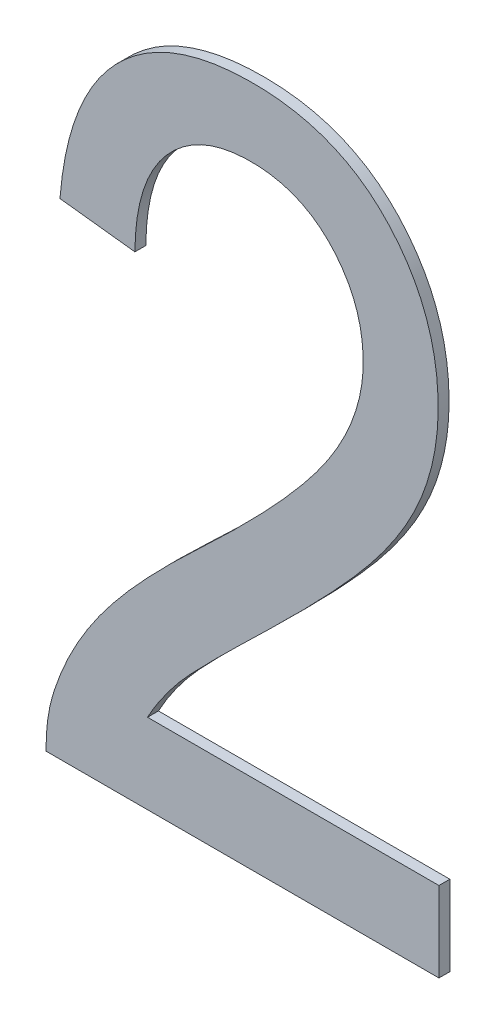
ISO-10303-21;
HEADER;
FILE_DESCRIPTION(('STEP AP214'),'2;1');
FILE_NAME('part.step','',(''),(''),'','','');
FILE_SCHEMA(('AUTOMOTIVE_DESIGN { 1 0 10303 214 1 1 1 1 }'));
ENDSEC;
DATA;
#1=APPLICATION_CONTEXT('core data for automotive mechanical design processes');
#2=APPLICATION_PROTOCOL_DEFINITION('international standard','automotive_design',2000,#1);
#3=PRODUCT_CONTEXT('',#1,'mechanical');
#4=PRODUCT('Part','Part','',(#3));
#5=PRODUCT_RELATED_PRODUCT_CATEGORY('part','',(#4));
#6=PRODUCT_DEFINITION_FORMATION('','',#4);
#7=PRODUCT_DEFINITION_CONTEXT('part definition',#1,'design');
#8=PRODUCT_DEFINITION('design','',#6,#7);
#9=PRODUCT_DEFINITION_SHAPE('','',#8);
#10=(LENGTH_UNIT() NAMED_UNIT(*) SI_UNIT(.MILLI.,.METRE.));
#11=(NAMED_UNIT(*) PLANE_ANGLE_UNIT() SI_UNIT($,.RADIAN.));
#12=(NAMED_UNIT(*) SI_UNIT($,.STERADIAN.) SOLID_ANGLE_UNIT());
#13=UNCERTAINTY_MEASURE_WITH_UNIT(LENGTH_MEASURE(1.E-05),#10,'distance_accuracy_value','');
#14=(GEOMETRIC_REPRESENTATION_CONTEXT(3) GLOBAL_UNCERTAINTY_ASSIGNED_CONTEXT((#13)) GLOBAL_UNIT_ASSIGNED_CONTEXT((#10,
#11,#12)) REPRESENTATION_CONTEXT('',''));
#15=CARTESIAN_POINT('',(0.,0.,0.));
#16=DIRECTION('',(0.,0.,1.));
#17=DIRECTION('',(1.,0.,0.));
#18=AXIS2_PLACEMENT_3D('',#15,#16,#17);
#19=CARTESIAN_POINT('',(2.715021731701,1.638412000728,1.11));
#20=DIRECTION('',(0.,0.,1.));
#21=DIRECTION('',(1.,0.,0.));
#22=AXIS2_PLACEMENT_3D('',#19,#20,#21);
#23=PLANE('',#22);
#24=CARTESIAN_POINT('',(2.721213661321,1.66435850046,1.11));
#25=CARTESIAN_POINT('',(2.72329393000518,1.67070243349372,1.11));
#26=CARTESIAN_POINT('',(2.72563352330744,1.67695689699947,1.11));
#27=CARTESIAN_POINT('',(2.72949501810525,1.68618847283412,1.11));
#28=CARTESIAN_POINT('',(2.73084039391473,1.6892397189239,1.11));
#29=CARTESIAN_POINT('',(2.73364261307884,1.69529050040378,1.11));
#30=CARTESIAN_POINT('',(2.73509945493101,1.69829003649021,1.11));
#31=CARTESIAN_POINT('',(2.73811815597819,1.7042357031484,1.11));
#32=CARTESIAN_POINT('',(2.73968001375582,1.70718183444026,1.11));
#33=CARTESIAN_POINT('',(2.74290222774084,1.71301945313452,1.11));
#34=CARTESIAN_POINT('',(2.74456258264867,1.7159109412572,1.11));
#35=CARTESIAN_POINT('',(2.74968378782231,1.72450543570374,1.11));
#36=CARTESIAN_POINT('',(2.75328371696529,1.730126397295,1.11));
#37=CARTESIAN_POINT('',(2.75892231477634,1.73839067284267,1.11));
#38=CARTESIAN_POINT('',(2.76084123938253,1.74111706190323,1.11));
#39=CARTESIAN_POINT('',(2.76475453638159,1.74651521539679,1.11));
#40=CARTESIAN_POINT('',(2.76674890804817,1.74918698035525,1.11));
#41=CARTESIAN_POINT('',(2.77283387890472,1.75712580540549,1.11));
#42=CARTESIAN_POINT('',(2.77702567110063,1.76231543313442,1.11));
#43=CARTESIAN_POINT('',(2.7834574555508,1.76997582400764,1.11));
#44=CARTESIAN_POINT('',(2.78562514703337,1.77250833377801,1.11));
#45=CARTESIAN_POINT('',(2.79219250144971,1.78005091260165,1.11));
#46=CARTESIAN_POINT('',(2.7966561042431,1.78500561279414,1.11));
#47=CARTESIAN_POINT('',(2.80344910716326,1.79234581829642,1.11));
#48=CARTESIAN_POINT('',(2.80572958902368,1.79477712423331,1.11));
#49=CARTESIAN_POINT('',(2.81261558787977,1.8020292475984,1.11));
#50=CARTESIAN_POINT('',(2.81726546260141,1.80680805429039,1.11));
#51=CARTESIAN_POINT('',(2.82665704888424,1.8162740774786,1.11));
#52=CARTESIAN_POINT('',(2.8313987585874,1.82096129582401,1.11));
#53=CARTESIAN_POINT('',(2.84096857758662,1.83024625279108,1.11));
#54=CARTESIAN_POINT('',(2.8457966857712,1.83484399256224,1.11));
#55=CARTESIAN_POINT('',(2.85548429315481,1.84400128193863,1.11));
#56=CARTESIAN_POINT('',(2.86034377547747,1.84856084946522,1.11));
#57=CARTESIAN_POINT('',(2.86999465272104,1.85775128290534,1.11));
#58=CARTESIAN_POINT('',(2.87478604856247,1.86238214785316,1.11));
#59=CARTESIAN_POINT('',(2.88909290259023,1.87637450451791,1.11));
#60=CARTESIAN_POINT('',(2.89852613910238,1.8858218722776,1.11));
#61=CARTESIAN_POINT('',(2.92056775807019,1.90865737564033,1.11));
#62=CARTESIAN_POINT('',(2.93302818909029,1.92218500261644,1.11));
#63=CARTESIAN_POINT('',(2.95668506890696,1.95033739204939,1.11));
#64=CARTESIAN_POINT('',(2.9678859382484,1.96495799723825,1.11));
#65=CARTESIAN_POINT('',(2.98180189965767,1.98811871521336,1.11));
#66=CARTESIAN_POINT('',(2.98588152230096,1.99581206259684,1.11));
#67=CARTESIAN_POINT('',(2.9930160694067,2.01166480286425,1.11));
#68=CARTESIAN_POINT('',(2.99607155694556,2.01982393675802,1.11));
#69=CARTESIAN_POINT('',(3.00081141445837,2.03668508620058,1.11));
#70=CARTESIAN_POINT('',(3.00247481854467,2.0453933500611,1.11));
#71=CARTESIAN_POINT('',(3.00397645251367,2.06296722689954,1.11));
#72=CARTESIAN_POINT('',(3.00381667676767,2.07183265735181,1.11));
#73=CARTESIAN_POINT('',(3.00202839787972,2.08669495100788,1.11));
#74=CARTESIAN_POINT('',(3.00085772709035,2.09275002786826,1.11));
#75=CARTESIAN_POINT('',(2.9975022575742,2.10457603326352,1.11));
#76=CARTESIAN_POINT('',(2.99531888857233,2.11034734974715,1.11));
#77=CARTESIAN_POINT('',(2.98994871458463,2.12141227550954,1.11));
#78=CARTESIAN_POINT('',(2.98675984514569,2.12670487287135,1.11));
#79=CARTESIAN_POINT('',(2.97955281446159,2.13670366257281,1.11));
#80=CARTESIAN_POINT('',(2.97553328096734,2.14140886364084,1.11));
#81=CARTESIAN_POINT('',(2.96676926818237,2.14994131200798,1.11));
#82=CARTESIAN_POINT('',(2.962038232671,2.15378208974685,1.11));
#83=CARTESIAN_POINT('',(2.95191267518114,2.16041298462471,1.11));
#84=CARTESIAN_POINT('',(2.94652066642477,2.16320692719363,1.11));
#85=CARTESIAN_POINT('',(2.9313372659297,2.16922762312125,1.11));
#86=CARTESIAN_POINT('',(2.9211140278046,2.17138209542904,1.11));
#87=CARTESIAN_POINT('',(2.90514013028058,2.17264151327572,1.11));
#88=CARTESIAN_POINT('',(2.89941517955221,2.17267477526941,1.11));
#89=CARTESIAN_POINT('',(2.88800283286891,2.17200906850209,1.11));
#90=CARTESIAN_POINT('',(2.8823153962913,2.17131110008581,1.11));
#91=CARTESIAN_POINT('',(2.87149550776904,2.16907399493723,1.11));
#92=CARTESIAN_POINT('',(2.86635127599333,2.16759376795483,1.11));
#93=CARTESIAN_POINT('',(2.85638905567219,2.16378507770012,1.11));
#94=CARTESIAN_POINT('',(2.85157068441457,2.16145763072014,1.11));
#95=CARTESIAN_POINT('',(2.84241783103275,2.15598712416586,1.11));
#96=CARTESIAN_POINT('',(2.83808375759633,2.15284338306436,1.11));
#97=CARTESIAN_POINT('',(2.82998355551045,2.14589007683995,1.11));
#98=CARTESIAN_POINT('',(2.82621820417595,2.14207961553299,1.11));
#99=CARTESIAN_POINT('',(2.81925597819165,2.13383461530065,1.11));
#100=CARTESIAN_POINT('',(2.81607237063749,2.12938886412027,1.11));
#101=CARTESIAN_POINT('',(2.81044474637974,2.12005969046976,1.11));
#102=CARTESIAN_POINT('',(2.80800029366214,2.11517652823292,1.11));
#103=CARTESIAN_POINT('',(2.80283842398331,2.10280575262099,1.11));
#104=CARTESIAN_POINT('',(2.8005146344383,2.09515522959819,1.11));
#105=CARTESIAN_POINT('',(2.7970831338037,2.07958388357653,1.11));
#106=CARTESIAN_POINT('',(2.79597949217082,2.07166224635725,1.11));
#107=CARTESIAN_POINT('',(2.7949324667285,2.05842700830469,1.11));
#108=CARTESIAN_POINT('',(2.79472349043189,2.05313366070658,1.11));
#109=CARTESIAN_POINT('',(2.794681949844,2.047849754735,1.11));
#110=B_SPLINE_CURVE_WITH_KNOTS('',3,(#24,#25,#26,#27,#28,#29,#30,#31,#32,#33,#34,#35,#36,#37,
#38,#39,#40,#41,#42,#43,#44,#45,#46,#47,#48,#49,#50,#51,#52,#53,#54,#55,#56,#57,#58,#59,#60,#61,
#62,#63,#64,#65,#66,#67,#68,#69,#70,#71,#72,#73,#74,#75,#76,#77,#78,#79,#80,#81,#82,#83,#84,#85,
#86,#87,#88,#89,#90,#91,#92,#93,#94,#95,#96,#97,#98,#99,#100,#101,#102,#103,#104,#105,#106,#107,
#108,#109),.UNSPECIFIED.,.F.,.F.,(4,2,2,2,2,2,2,2,2,2,2,2,2,2,2,2,2,2,2,2,2,2,2,2,2,2,2,2,2,2,2,
2,2,2,2,2,2,2,2,2,2,2,4),(0.,0.0200160135525452,0.0300177989460808,0.0400194495489698,
0.0500209651894125,0.0600223488995326,0.0800320950154514,0.0900331217246663,0.100034052183449,
0.120039414620357,0.130039839510025,0.150042306028592,0.160042518386877,0.180043817619683,
0.200044712602522,0.220045350469358,0.240036002474969,0.260026383949558,0.300068217682964,
0.355248880399983,0.410229402857382,0.436290561589298,0.462337368125967,0.488769739997318,
0.515173200345515,0.53360780060873,0.552016453797352,0.570463151735987,0.588940570602834,
0.607104773059731,0.625201935595861,0.655999406771053,0.673148490125452,0.690274143625454,
0.706263041437928,0.722232822452997,0.738215979815321,0.754220788629263,0.77055438079848,
0.786878319197798,0.810727316267535,0.834655617157256,0.850524383972508),.UNSPECIFIED.);
#111=CARTESIAN_POINT('',(2.721213661321,1.66435850046,1.11));
#112=VERTEX_POINT('',#111);
#113=CARTESIAN_POINT('',(2.794681949844,2.047849754735,1.11));
#114=VERTEX_POINT('',#113);
#115=EDGE_CURVE('E182',#112,#114,#110,.T.);
#116=ORIENTED_EDGE('',*,*,#115,.F.);
#117=CARTESIAN_POINT('',(2.713421570114,1.611391852731,1.11));
#118=CARTESIAN_POINT('',(2.71326292657197,1.61806923818245,1.11));
#119=CARTESIAN_POINT('',(2.71350360136354,1.62476340359135,1.11));
#120=CARTESIAN_POINT('',(2.71472074181933,1.63697885119607,1.11));
#121=CARTESIAN_POINT('',(2.71557065890197,1.6425131826524,1.11));
#122=CARTESIAN_POINT('',(2.71790279720354,1.65352036773723,1.11));
#123=CARTESIAN_POINT('',(2.7193929834949,1.65899152409922,1.11));
#124=CARTESIAN_POINT('',(2.721213661321,1.66435850046,1.11));
#125=B_SPLINE_CURVE_WITH_KNOTS('',3,(#117,#118,#119,#120,#121,#122,#123,#124),.UNSPECIFIED.,.F.,
.F.,(4,2,2,4),(0.,0.0200360460784031,0.0368007991509652,0.0537804384443434),.UNSPECIFIED.);
#126=CARTESIAN_POINT('',(2.713421570114,1.611391852731,1.11));
#127=VERTEX_POINT('',#126);
#128=EDGE_CURVE('E153',#127,#112,#125,.T.);
#129=ORIENTED_EDGE('',*,*,#128,.F.);
#130=DIRECTION('',(1.,0.,0.));
#131=VECTOR('',#130,1.);
#132=CARTESIAN_POINT('',(3.072970921521,1.611391852731,1.11));
#133=LINE('',#132,#131);
#134=CARTESIAN_POINT('',(3.072970921521,1.611391852731,1.11));
#135=VERTEX_POINT('',#134);
#136=EDGE_CURVE('E121',#135,#127,#133,.F.);
#137=ORIENTED_EDGE('',*,*,#136,.F.);
#138=DIRECTION('',(0.,1.,0.));
#139=VECTOR('',#138,1.);
#140=CARTESIAN_POINT('',(3.072970921521,1.68471805274,1.11));
#141=LINE('',#140,#139);
#142=CARTESIAN_POINT('',(3.072970921521,1.68471805274,1.11));
#143=VERTEX_POINT('',#142);
#144=EDGE_CURVE('E97',#143,#135,#141,.F.);
#145=ORIENTED_EDGE('',*,*,#144,.F.);
#146=DIRECTION('',(1.,0.,0.));
#147=VECTOR('',#146,1.);
#148=CARTESIAN_POINT('',(2.806230942168,1.68471805274,1.11));
#149=LINE('',#148,#147);
#150=CARTESIAN_POINT('',(2.806230942168,1.68471805274,1.11));
#151=VERTEX_POINT('',#150);
#152=EDGE_CURVE('E93',#151,#143,#149,.T.);
#153=ORIENTED_EDGE('',*,*,#152,.F.);
#154=CARTESIAN_POINT('',(2.726083718325,2.055802704845,1.11));
#155=CARTESIAN_POINT('',(2.72662499351014,2.06244375432386,1.11));
#156=CARTESIAN_POINT('',(2.72734010173738,2.0690813828633,1.11));
#157=CARTESIAN_POINT('',(2.73014393845678,2.08915562963212,1.11));
#158=CARTESIAN_POINT('',(2.73288812992501,2.10250642775137,1.11));
#159=CARTESIAN_POINT('',(2.74066947551463,2.12852943791268,1.11));
#160=CARTESIAN_POINT('',(2.74569786362637,2.14120403906964,1.11));
#161=CARTESIAN_POINT('',(2.75620154415105,2.16069876733565,1.11));
#162=CARTESIAN_POINT('',(2.7608418098546,2.16796555157004,1.11));
#163=CARTESIAN_POINT('',(2.77127842021073,2.18162296009262,1.11));
#164=CARTESIAN_POINT('',(2.77707457376851,2.18801372891198,1.11));
#165=CARTESIAN_POINT('',(2.78970500272963,2.199724570316,1.11));
#166=CARTESIAN_POINT('',(2.79654297883105,2.20504066231445,1.11));
#167=CARTESIAN_POINT('',(2.81104597037033,2.21436866502342,1.11));
#168=CARTESIAN_POINT('',(2.81871006092375,2.21838201444012,1.11));
#169=CARTESIAN_POINT('',(2.83428330729185,2.22494581528963,1.11));
#170=CARTESIAN_POINT('',(2.84217163044153,2.22754669136116,1.11));
#171=CARTESIAN_POINT('',(2.85825548187206,2.23162827775302,1.11));
#172=CARTESIAN_POINT('',(2.8664520142934,2.23310491979223,1.11));
#173=CARTESIAN_POINT('',(2.88100803595254,2.23484529941343,1.11));
#174=CARTESIAN_POINT('',(2.88734513596146,2.23531289114259,1.11));
#175=CARTESIAN_POINT('',(2.90003712115947,2.23577076378513,1.11));
#176=CARTESIAN_POINT('',(2.90639201585953,2.23576070129965,1.11));
#177=CARTESIAN_POINT('',(2.92540683252024,2.23494048088909,1.11));
#178=CARTESIAN_POINT('',(2.93805880965726,2.23334542936804,1.11));
#179=CARTESIAN_POINT('',(2.95866624411118,2.22839933070472,1.11));
#180=CARTESIAN_POINT('',(2.96680008667436,2.2257965694251,1.11));
#181=CARTESIAN_POINT('',(2.98249886271411,2.21926746534049,1.11));
#182=CARTESIAN_POINT('',(2.9900654611151,2.21534519764589,1.11));
#183=CARTESIAN_POINT('',(3.00430907866924,2.20627223325161,1.11));
#184=CARTESIAN_POINT('',(3.01099502590897,2.20113562992901,1.11));
#185=CARTESIAN_POINT('',(3.02028224694063,2.19265899986081,1.11));
#186=CARTESIAN_POINT('',(3.02325056165652,2.1897097190496,1.11));
#187=CARTESIAN_POINT('',(3.02752416681016,2.18512200674809,1.11));
#188=CARTESIAN_POINT('',(3.02891844067327,2.18356603560224,1.11));
#189=CARTESIAN_POINT('',(3.03165306537742,2.18040761034728,1.11));
#190=CARTESIAN_POINT('',(3.03299341640551,2.17880515639944,1.11));
#191=CARTESIAN_POINT('',(3.03692795304738,2.17392414047617,1.11));
#192=CARTESIAN_POINT('',(3.03943416949428,2.17057348109711,1.11));
#193=CARTESIAN_POINT('',(3.04299974844714,2.16541663211919,1.11));
#194=CARTESIAN_POINT('',(3.04415572396379,2.16367631545473,1.11));
#195=CARTESIAN_POINT('',(3.04640125324324,2.16015334155202,1.11));
#196=CARTESIAN_POINT('',(3.04749080676522,2.1583706841603,1.11));
#197=CARTESIAN_POINT('',(3.05065813138004,2.15295972156811,1.11));
#198=CARTESIAN_POINT('',(3.05263326181591,2.14927031022123,1.11));
#199=CARTESIAN_POINT('',(3.05537954803719,2.14363403888285,1.11));
#200=CARTESIAN_POINT('',(3.05625869822405,2.14173878691484,1.11));
#201=CARTESIAN_POINT('',(3.05794470536845,2.13791619928371,1.11));
#202=CARTESIAN_POINT('',(3.05875156250403,2.13598886369962,1.11));
#203=CARTESIAN_POINT('',(3.06029238659662,2.13210548382997,1.11));
#204=CARTESIAN_POINT('',(3.06102635383742,2.13014943965622,1.11));
#205=CARTESIAN_POINT('',(3.06311979546828,2.12423988599145,1.11));
#206=CARTESIAN_POINT('',(3.06436997530715,2.12024685215332,1.11));
#207=CARTESIAN_POINT('',(3.06602896780049,2.11420089166885,1.11));
#208=CARTESIAN_POINT('',(3.06654581410069,2.11217669694561,1.11));
#209=CARTESIAN_POINT('',(3.06750901061084,2.10811160075041,1.11));
#210=CARTESIAN_POINT('',(3.06795536137276,2.10607069940939,1.11));
#211=CARTESIAN_POINT('',(3.06919108610073,2.09992494457769,1.11));
#212=CARTESIAN_POINT('',(3.06987669298546,2.09579865401126,1.11));
#213=CARTESIAN_POINT('',(3.0707077859009,2.08958541354273,1.11));
#214=CARTESIAN_POINT('',(3.07095189970642,2.08751080938787,1.11));
#215=CARTESIAN_POINT('',(3.07158927293486,2.08127534527995,1.11));
#216=CARTESIAN_POINT('',(3.07188734543747,2.07710416468066,1.11));
#217=CARTESIAN_POINT('',(3.07215628262792,2.07084186338622,1.11));
#218=CARTESIAN_POINT('',(3.07221623814455,2.06875387089992,1.11));
#219=CARTESIAN_POINT('',(3.07228042135491,2.06457691294698,1.11));
#220=CARTESIAN_POINT('',(3.07228464922624,2.06248794748346,1.11));
#221=CARTESIAN_POINT('',(3.07223048132998,2.05831072571959,1.11));
#222=CARTESIAN_POINT('',(3.07217208441721,2.05622246943292,1.11));
#223=CARTESIAN_POINT('',(3.07203730325474,2.05309233566516,1.11));
#224=CARTESIAN_POINT('',(3.07198451511774,2.05204937672191,1.11));
#225=CARTESIAN_POINT('',(3.07180248816348,2.04892161091446,1.11));
#226=CARTESIAN_POINT('',(3.07164959181998,2.04683809489404,1.11));
#227=CARTESIAN_POINT('',(3.07137293460463,2.04371728134516,1.11));
#228=CARTESIAN_POINT('',(3.07127283539324,2.04267779808626,1.11));
#229=CARTESIAN_POINT('',(3.07094886799752,2.03956153788224,1.11));
#230=CARTESIAN_POINT('',(3.0707013432487,2.03748713036528,1.11));
#231=CARTESIAN_POINT('',(3.07028302278523,2.03438212802858,1.11));
#232=CARTESIAN_POINT('',(3.070135751118,2.03334827325572,1.11));
#233=CARTESIAN_POINT('',(3.06967045378729,2.0302499656468,1.11));
#234=CARTESIAN_POINT('',(3.06932896695774,2.02818894681817,1.11));
#235=CARTESIAN_POINT('',(3.06877036699038,2.02510609385433,1.11));
#236=CARTESIAN_POINT('',(3.06857644803751,2.02407996596069,1.11));
#237=CARTESIAN_POINT('',(3.06797158606507,2.02100586285792,1.11));
#238=CARTESIAN_POINT('',(3.06753756649377,2.01896234051925,1.11));
#239=CARTESIAN_POINT('',(3.06684118792384,2.01590766659064,1.11));
#240=CARTESIAN_POINT('',(3.06660151459546,2.01489125285224,1.11));
#241=CARTESIAN_POINT('',(3.06585994504534,2.01184724612398,1.11));
#242=CARTESIAN_POINT('',(3.06533553435309,2.00982505275078,1.11));
#243=CARTESIAN_POINT('',(3.06450488885198,2.00680413535514,1.11));
#244=CARTESIAN_POINT('',(3.06422068130551,2.00579926586862,1.11));
#245=CARTESIAN_POINT('',(3.06334626885598,2.00279074203732,1.11));
#246=CARTESIAN_POINT('',(3.06273431469019,2.00079332852603,1.11));
#247=CARTESIAN_POINT('',(3.06177364769257,1.99781121343841,1.11));
#248=CARTESIAN_POINT('',(3.06144631642488,1.99681954792996,1.11));
#249=CARTESIAN_POINT('',(3.06044420040903,1.99385117155164,1.11));
#250=CARTESIAN_POINT('',(3.05974933836175,1.9918812267755,1.11));
#251=CARTESIAN_POINT('',(3.05611754290492,1.98207359933631,1.11));
#252=CARTESIAN_POINT('',(3.05272104072632,1.9744019998561,1.11));
#253=CARTESIAN_POINT('',(3.0451308407399,1.95937808012705,1.11));
#254=CARTESIAN_POINT('',(3.04092937061785,1.95202981094858,1.11));
#255=CARTESIAN_POINT('',(3.03195330149545,1.93769011235167,1.11));
#256=CARTESIAN_POINT('',(3.02717837759498,1.93069888845058,1.11));
#257=CARTESIAN_POINT('',(3.0171548233153,1.91701728872549,1.11));
#258=CARTESIAN_POINT('',(3.01190407319859,1.91032848029371,1.11));
#259=CARTESIAN_POINT('',(3.00106923992502,1.89723077145243,1.11));
#260=CARTESIAN_POINT('',(2.99548516737209,1.89082186214977,1.11));
#261=CARTESIAN_POINT('',(2.98224663773794,1.8760573474752,1.11));
#262=CARTESIAN_POINT('',(2.97452248310243,1.86776491364172,1.11));
#263=CARTESIAN_POINT('',(2.95887386885342,1.85137297072341,1.11));
#264=CARTESIAN_POINT('',(2.9509494147297,1.84327345636284,1.11));
#265=CARTESIAN_POINT('',(2.93497696378009,1.82723116608127,1.11));
#266=CARTESIAN_POINT('',(2.92692925856552,1.81928809890455,1.11));
#267=CARTESIAN_POINT('',(2.91074178329941,1.80349694939632,1.11));
#268=CARTESIAN_POINT('',(2.90260201303972,1.79564886727965,1.11));
#269=CARTESIAN_POINT('',(2.88643494576517,1.77990118689329,1.11));
#270=CARTESIAN_POINT('',(2.87840732928128,1.77200191980512,1.11));
#271=CARTESIAN_POINT('',(2.86246450874545,1.75608789606604,1.11));
#272=CARTESIAN_POINT('',(2.85454933511984,1.74807310929521,1.11));
#273=CARTESIAN_POINT('',(2.84293090900512,1.73574953878629,1.11));
#274=CARTESIAN_POINT('',(2.83908925104368,1.73157836315322,1.11));
#275=CARTESIAN_POINT('',(2.83453644325464,1.72615264138352,1.11));
#276=CARTESIAN_POINT('',(2.83363846387189,1.72505706036093,1.11));
#277=CARTESIAN_POINT('',(2.83096428363733,1.72175426090632,1.11));
#278=CARTESIAN_POINT('',(2.82920789135894,1.71953104567811,1.11));
#279=CARTESIAN_POINT('',(2.82662194561163,1.7161590765893,1.11));
#280=CARTESIAN_POINT('',(2.82576809643273,1.71502893133712,1.11));
#281=CARTESIAN_POINT('',(2.82323152668993,1.71161941987851,1.11));
#282=CARTESIAN_POINT('',(2.82157394604296,1.70932118293815,1.11));
#283=CARTESIAN_POINT('',(2.81914506571686,1.70583418266816,1.11));
#284=CARTESIAN_POINT('',(2.81834505278287,1.70466529119146,1.11));
#285=CARTESIAN_POINT('',(2.81597516214608,1.70113771601268,1.11));
#286=CARTESIAN_POINT('',(2.81443564011031,1.69875841851036,1.11));
#287=CARTESIAN_POINT('',(2.81219557222894,1.69514696801565,1.11));
#288=CARTESIAN_POINT('',(2.81146045821536,1.69393613647337,1.11));
#289=CARTESIAN_POINT('',(2.80917563900689,1.6900859043555,1.11));
#290=CARTESIAN_POINT('',(2.80767092273034,1.68741981360074,1.11));
#291=CARTESIAN_POINT('',(2.806230942168,1.68471805274,1.11));
#292=B_SPLINE_CURVE_WITH_KNOTS('',3,(#154,#155,#156,#157,#158,#159,#160,#161,#162,#163,#164,
#165,#166,#167,#168,#169,#170,#171,#172,#173,#174,#175,#176,#177,#178,#179,#180,#181,#182,#183,
#184,#185,#186,#187,#188,#189,#190,#191,#192,#193,#194,#195,#196,#197,#198,#199,#200,#201,#202,
#203,#204,#205,#206,#207,#208,#209,#210,#211,#212,#213,#214,#215,#216,#217,#218,#219,#220,#221,
#222,#223,#224,#225,#226,#227,#228,#229,#230,#231,#232,#233,#234,#235,#236,#237,#238,#239,#240,
#241,#242,#243,#244,#245,#246,#247,#248,#249,#250,#251,#252,#253,#254,#255,#256,#257,#258,#259,
#260,#261,#262,#263,#264,#265,#266,#267,#268,#269,#270,#271,#272,#273,#274,#275,#276,#277,#278,
#279,#280,#281,#282,#283,#284,#285,#286,#287,#288,#289,#290,#291),.UNSPECIFIED.,.F.,.F.,(4,2,2,
2,2,2,2,2,2,2,2,2,2,2,2,2,2,2,2,2,2,2,2,2,2,2,2,2,2,2,2,2,2,2,2,2,2,2,2,2,2,2,2,2,2,2,2,2,2,2,2,
2,2,2,2,2,2,2,2,2,2,2,2,2,2,2,2,2,4),(0.,0.0200081296615927,0.0607603022773247,0.10135738546673,
0.127116829909461,0.152872019249936,0.17872092467,0.204541185509191,0.229366205793695,
0.254280639246258,0.273322419562886,0.292377889750795,0.330363281063482,0.355879742881397,
0.381318113283294,0.406474609889276,0.419016159669868,0.425282613901215,0.431549046392773,
0.44408828527537,0.450354830784805,0.456621399011624,0.469161394077544,0.475427974003989,
0.48169453849666,0.487961078588688,0.500500360695807,0.506766784074543,0.513033158385192,
0.525570914358547,0.53183712942507,0.544373599839916,0.550639659513785,0.556905699217263,
0.563171853506363,0.566304666832449,0.572570832960322,0.575703647166281,0.581969816397356,
0.58510263037097,0.591368793792415,0.594501606435506,0.600767755465119,0.6039005657529,
0.610166692605387,0.613299499641683,0.619565597698257,0.622698400750879,0.628964464797116,
0.654070522798071,0.679432465687305,0.704808846218315,0.730304424438039,0.755799192003718,
0.789791877747518,0.823783632830286,0.857704607284376,0.891625658447121,0.925411159701362,
0.95920563533561,0.976206103686848,0.980455452556129,0.988954384848964,0.993203588477843,
1.00170277947403,1.00595202164401,1.01445156784196,1.01870086274936,1.0278828921034),.UNSPECIFIED.);
#293=CARTESIAN_POINT('',(2.72608371832497,2.05580270484474,1.11));
#294=VERTEX_POINT('',#293);
#295=EDGE_CURVE('E24',#294,#151,#292,.T.);
#296=ORIENTED_EDGE('',*,*,#295,.F.);
#297=DIRECTION('',(0.993346511383226,-0.115163832529026,0.));
#298=VECTOR('',#297,1.);
#299=CARTESIAN_POINT('',(2.794681949844,2.047849754735,1.11));
#300=LINE('',#299,#298);
#301=EDGE_CURVE('E80',#114,#294,#300,.F.);
#302=ORIENTED_EDGE('',*,*,#301,.F.);
#303=EDGE_LOOP('',(#116,#129,#137,#145,#153,#296,#302));
#304=FACE_BOUND('',#303,.T.);
#305=ADVANCED_FACE('F17',(#304),#23,.T.);
#306=CARTESIAN_POINT('',(2.806230942168,1.68471805274,1.11));
#307=DIRECTION('',(0.,1.,0.));
#308=DIRECTION('',(0.,0.,1.));
#309=AXIS2_PLACEMENT_3D('',#306,#307,#308);
#310=PLANE('',#309);
#311=DIRECTION('',(1.,0.,0.));
#312=VECTOR('',#311,1.);
#313=CARTESIAN_POINT('',(2.715021731701,1.68471805274,1.1));
#314=LINE('',#313,#312);
#315=CARTESIAN_POINT('',(3.072970921521,1.68471805274,1.1));
#316=VERTEX_POINT('',#315);
#317=CARTESIAN_POINT('',(2.806230942168,1.68471805274,1.1));
#318=VERTEX_POINT('',#317);
#319=EDGE_CURVE('E105',#316,#318,#314,.F.);
#320=ORIENTED_EDGE('',*,*,#319,.T.);
#321=DIRECTION('',(0.,0.,-1.));
#322=VECTOR('',#321,1.);
#323=CARTESIAN_POINT('',(2.806230942168,1.68471805274,1.105));
#324=LINE('',#323,#322);
#325=EDGE_CURVE('E89',#151,#318,#324,.T.);
#326=ORIENTED_EDGE('',*,*,#325,.F.);
#327=ORIENTED_EDGE('',*,*,#152,.T.);
#328=DIRECTION('',(0.,0.,-1.));
#329=VECTOR('',#328,1.);
#330=CARTESIAN_POINT('',(3.072970921521,1.68471805274,1.11));
#331=LINE('',#330,#329);
#332=EDGE_CURVE('E111',#316,#143,#331,.F.);
#333=ORIENTED_EDGE('',*,*,#332,.F.);
#334=EDGE_LOOP('',(#320,#326,#327,#333));
#335=FACE_BOUND('',#334,.T.);
#336=ADVANCED_FACE('F103',(#335),#310,.T.);
#337=CARTESIAN_POINT('',(2.726083718325,2.055802704845,1.11));
#338=CARTESIAN_POINT('',(2.726083718325,2.055802704845,1.1));
#339=CARTESIAN_POINT('',(2.730814630844,2.11433641765,1.11));
#340=CARTESIAN_POINT('',(2.730814630844,2.11433641765,1.1));
#341=CARTESIAN_POINT('',(2.748485980545,2.159031997265,1.11));
#342=CARTESIAN_POINT('',(2.748485980545,2.159031997265,1.1));
#343=CARTESIAN_POINT('',(2.809779008896,2.220498423178,1.11));
#344=CARTESIAN_POINT('',(2.809779008896,2.220498423178,1.1));
#345=CARTESIAN_POINT('',(2.851035466609,2.235698436319,1.11));
#346=CARTESIAN_POINT('',(2.851035466609,2.235698436319,1.1));
#347=CARTESIAN_POINT('',(2.954837253044,2.235698436319,1.11));
#348=CARTESIAN_POINT('',(2.954837253044,2.235698436319,1.1));
#349=CARTESIAN_POINT('',(2.996163165338,2.219156300092,1.11));
#350=CARTESIAN_POINT('',(2.996163165338,2.219156300092,1.1));
#351=CARTESIAN_POINT('',(3.057108450136,2.152987755182,1.11));
#352=CARTESIAN_POINT('',(3.057108450136,2.152987755182,1.1));
#353=CARTESIAN_POINT('',(3.072275199092,2.111950532617,1.11));
#354=CARTESIAN_POINT('',(3.072275199092,2.111950532617,1.1));
#355=CARTESIAN_POINT('',(3.072275199092,2.038147155602,1.11));
#356=CARTESIAN_POINT('',(3.072275199092,2.038147155602,1.1));
#357=CARTESIAN_POINT('',(3.067822575545,2.013652069265,1.11));
#358=CARTESIAN_POINT('',(3.067822575545,2.013652069265,1.1));
#359=CARTESIAN_POINT('',(3.050012081358,1.965616250604,1.11));
#360=CARTESIAN_POINT('',(3.050012081358,1.965616250604,1.1));
#361=CARTESIAN_POINT('',(3.035262765859,1.940325869256,1.11));
#362=CARTESIAN_POINT('',(3.035262765859,1.940325869256,1.1));
#363=CARTESIAN_POINT('',(2.993850274964,1.887267510794,1.11));
#364=CARTESIAN_POINT('',(2.993850274964,1.887267510794,1.1));
#365=CARTESIAN_POINT('',(2.959568165563,1.850775651024,1.11));
#366=CARTESIAN_POINT('',(2.959568165563,1.850775651024,1.1));
#367=CARTESIAN_POINT('',(2.871629064427,1.765693584076,1.11));
#368=CARTESIAN_POINT('',(2.871629064427,1.765693584076,1.1));
#369=CARTESIAN_POINT('',(2.845747976147,1.739752467497,1.11));
#370=CARTESIAN_POINT('',(2.845747976147,1.739752467497,1.1));
#371=CARTESIAN_POINT('',(2.823150098801,1.7123257816,1.11));
#372=CARTESIAN_POINT('',(2.823150098801,1.7123257816,1.1));
#373=CARTESIAN_POINT('',(2.813605599918,1.698556185931,1.11));
#374=CARTESIAN_POINT('',(2.813605599918,1.698556185931,1.1));
#375=CARTESIAN_POINT('',(2.806230942168,1.68471805274,1.11));
#376=CARTESIAN_POINT('',(2.806230942168,1.68471805274,1.1));
#377=B_SPLINE_SURFACE_WITH_KNOTS('',3,1,((#337,#338),(#339,#340),(#341,#342),(#343,#344),(#345,
#346),(#347,#348),(#349,#350),(#351,#352),(#353,#354),(#355,#356),(#357,#358),(#359,#360),(#361,
#362),(#363,#364),(#365,#366),(#367,#368),(#369,#370),(#371,#372),(#373,#374),(#375,#376)),
.UNSPECIFIED.,.F.,.F.,.F.,(4,2,2,2,2,2,2,2,2,4),(2,2),(0.,0.155199785715,0.31075170168,
0.467980727252,0.625209752824,0.705616778931,0.786023805038,0.866226964718,0.932946337261,1.),
(0.,1.),.UNSPECIFIED.);
#378=CARTESIAN_POINT('',(2.806230942168,1.68471805274,1.1));
#379=CARTESIAN_POINT('',(2.8093814531174,1.69061044580864,1.1));
#380=CARTESIAN_POINT('',(2.81282417002361,1.69633645320171,1.1));
#381=CARTESIAN_POINT('',(2.81833799543121,1.70469033948486,1.1));
#382=CARTESIAN_POINT('',(2.82023319577547,1.70743446957356,1.1));
#383=CARTESIAN_POINT('',(2.82412735366794,1.71284997733638,1.1));
#384=CARTESIAN_POINT('',(2.82612637486058,1.71552130881651,1.1));
#385=CARTESIAN_POINT('',(2.83019801583788,1.72080725987417,1.1));
#386=CARTESIAN_POINT('',(2.83227062091129,1.72342189062109,1.1));
#387=CARTESIAN_POINT('',(2.83867881589699,1.73111921626943,1.1));
#388=CARTESIAN_POINT('',(2.84319901528619,1.73604688362395,1.1));
#389=CARTESIAN_POINT('',(2.85238495834218,1.74576437943673,1.1));
#390=CARTESIAN_POINT('',(2.85705083501334,1.75055407377182,1.1));
#391=CARTESIAN_POINT('',(2.8711564690241,1.7648444043083,1.1));
#392=CARTESIAN_POINT('',(2.8806913587621,1.77425254090857,1.1));
#393=CARTESIAN_POINT('',(2.89484974231184,1.78810474671805,1.1));
#394=CARTESIAN_POINT('',(2.89944327457127,1.79258072569472,1.1));
#395=CARTESIAN_POINT('',(2.90865005844239,1.80151244147125,1.1));
#396=CARTESIAN_POINT('',(2.91326330986416,1.80596817846521,1.1));
#397=CARTESIAN_POINT('',(2.92705407312289,1.81939053043755,1.1));
#398=CARTESIAN_POINT('',(2.93618027745685,1.82841009988749,1.1));
#399=CARTESIAN_POINT('',(2.95425945382519,1.84663631866096,1.1));
#400=CARTESIAN_POINT('',(2.96321227911161,1.8558431140069,1.1));
#401=CARTESIAN_POINT('',(2.98083825237033,1.87451969369713,1.1));
#402=CARTESIAN_POINT('',(2.98951146070122,1.88398942045195,1.1));
#403=CARTESIAN_POINT('',(3.00308443114217,1.89964235733114,1.1));
#404=CARTESIAN_POINT('',(3.00814712039562,1.90568135332135,1.1));
#405=CARTESIAN_POINT('',(3.01792063418233,1.91803550689225,1.1));
#406=CARTESIAN_POINT('',(3.02263142242967,1.92435069284585,1.1));
#407=CARTESIAN_POINT('',(3.03611255749891,1.94367549160169,1.1));
#408=CARTESIAN_POINT('',(3.04429265740204,1.95713171016082,1.1));
#409=CARTESIAN_POINT('',(3.05362298022779,1.97654829760253,1.1));
#410=CARTESIAN_POINT('',(3.05597026295165,1.9819335566124,1.1));
#411=CARTESIAN_POINT('',(3.05913066042008,1.99014760012587,1.1));
#412=CARTESIAN_POINT('',(3.06012381064386,1.99290751474106,1.1));
#413=CARTESIAN_POINT('',(3.06200295077067,1.99846348345218,1.1));
#414=CARTESIAN_POINT('',(3.06288894249443,2.00125953693318,1.1));
#415=CARTESIAN_POINT('',(3.06454596447661,2.00688562803346,1.1));
#416=CARTESIAN_POINT('',(3.06531699366315,2.00971566596934,1.1));
#417=CARTESIAN_POINT('',(3.06674147277732,2.01540520716758,1.1));
#418=CARTESIAN_POINT('',(3.06739492179901,2.0182647106568,1.1));
#419=CARTESIAN_POINT('',(3.06858107358656,2.02400870374069,1.1));
#420=CARTESIAN_POINT('',(3.06911377565878,2.02689319347881,1.1));
#421=CARTESIAN_POINT('',(3.07005634052105,2.03268218108692,1.1));
#422=CARTESIAN_POINT('',(3.07046620287949,2.03558667902718,1.1));
#423=CARTESIAN_POINT('',(3.07116192575917,2.04141053716595,1.1));
#424=CARTESIAN_POINT('',(3.07144778614272,2.04432989738095,1.1));
#425=CARTESIAN_POINT('',(3.0718946563178,2.05017800699976,1.1));
#426=CARTESIAN_POINT('',(3.0720556662777,2.0531067563909,1.1));
#427=CARTESIAN_POINT('',(3.07235501946676,2.06190347049647,1.1));
#428=CARTESIAN_POINT('',(3.07230926912422,2.06777836933912,1.1));
#429=CARTESIAN_POINT('',(3.07176036665781,2.07950664617306,1.1));
#430=CARTESIAN_POINT('',(3.07125720119671,2.08536002353184,1.1));
#431=CARTESIAN_POINT('',(3.06973035593397,2.09700185413855,1.1));
#432=CARTESIAN_POINT('',(3.06870657780128,2.10279029491036,1.1));
#433=CARTESIAN_POINT('',(3.06610359990148,2.11424325819663,1.1));
#434=CARTESIAN_POINT('',(3.06452429920367,2.11990775799394,1.1));
#435=CARTESIAN_POINT('',(3.06078822358109,2.13104505635303,1.1));
#436=CARTESIAN_POINT('',(3.05863136785572,2.13651782797058,1.1));
#437=CARTESIAN_POINT('',(3.05374594125912,2.14720288007138,1.1));
#438=CARTESIAN_POINT('',(3.05101733430639,2.15241514408904,1.1));
#439=CARTESIAN_POINT('',(3.04501626970053,2.16251593191244,1.1));
#440=CARTESIAN_POINT('',(3.04174382942031,2.16740446605284,1.1));
#441=CARTESIAN_POINT('',(3.03472372000879,2.17682333113684,1.1));
#442=CARTESIAN_POINT('',(3.03097610681127,2.18135370413873,1.1));
#443=CARTESIAN_POINT('',(3.02130833253041,2.19186191222541,1.1));
#444=CARTESIAN_POINT('',(3.01514701165546,2.19762425202073,1.1));
#445=CARTESIAN_POINT('',(3.00190578201452,2.20797568631742,1.1));
#446=CARTESIAN_POINT('',(2.99482628549258,2.21256530461896,1.1));
#447=CARTESIAN_POINT('',(2.98007721944642,2.22040652514306,1.1));
#448=CARTESIAN_POINT('',(2.97241576938642,2.22367355356808,1.1));
#449=CARTESIAN_POINT('',(2.95666167950903,2.22897724543394,1.1));
#450=CARTESIAN_POINT('',(2.94856787776428,2.23101039104968,1.1));
#451=CARTESIAN_POINT('',(2.92813615877759,2.23469147125115,1.1));
#452=CARTESIAN_POINT('',(2.91568037956432,2.23565068759529,1.1));
#453=CARTESIAN_POINT('',(2.89076036496766,2.23574491922625,1.1));
#454=CARTESIAN_POINT('',(2.87829613215322,2.23487828021248,1.1));
#455=CARTESIAN_POINT('',(2.85705433571453,2.23139344365225,1.1));
#456=CARTESIAN_POINT('',(2.8481937946287,2.2293140889967,1.1));
#457=CARTESIAN_POINT('',(2.83094985805593,2.22373449183031,1.1));
#458=CARTESIAN_POINT('',(2.8225649850006,2.22023895910902,1.1));
#459=CARTESIAN_POINT('',(2.80650814947773,2.21173521556857,1.1));
#460=CARTESIAN_POINT('',(2.7988424364722,2.20671511062523,1.1));
#461=CARTESIAN_POINT('',(2.78457391891753,2.19534191436823,1.1));
#462=CARTESIAN_POINT('',(2.77797117245448,2.18898875025288,1.1));
#463=CARTESIAN_POINT('',(2.7665795591357,2.1758367010441,1.1));
#464=CARTESIAN_POINT('',(2.76167951107647,2.16913310990524,1.1));
#465=CARTESIAN_POINT('',(2.75293356563173,2.15504308304428,1.1));
#466=CARTESIAN_POINT('',(2.74909163486623,2.1476542130451,1.1));
#467=CARTESIAN_POINT('',(2.73987528712931,2.12672211944797,1.1));
#468=CARTESIAN_POINT('',(2.73552946978184,2.11273908127389,1.1));
#469=CARTESIAN_POINT('',(2.72923112461928,2.08440094192604,1.1));
#470=CARTESIAN_POINT('',(2.72725007227728,2.07005245280927,1.1));
#471=CARTESIAN_POINT('',(2.726083718325,2.055802704845,1.1));
#472=B_SPLINE_CURVE_WITH_KNOTS('',3,(#378,#379,#380,#381,#382,#383,#384,#385,#386,#387,#388,
#389,#390,#391,#392,#393,#394,#395,#396,#397,#398,#399,#400,#401,#402,#403,#404,#405,#406,#407,
#408,#409,#410,#411,#412,#413,#414,#415,#416,#417,#418,#419,#420,#421,#422,#423,#424,#425,#426,
#427,#428,#429,#430,#431,#432,#433,#434,#435,#436,#437,#438,#439,#440,#441,#442,#443,#444,#445,
#446,#447,#448,#449,#450,#451,#452,#453,#454,#455,#456,#457,#458,#459,#460,#461,#462,#463,#464,
#465,#466,#467,#468,#469,#470,#471),.UNSPECIFIED.,.F.,.F.,(4,2,2,2,2,2,2,2,2,2,2,2,2,2,2,2,2,2,
2,2,2,2,2,2,2,2,2,2,2,2,2,2,2,2,2,2,2,2,2,2,2,2,2,2,2,2,4),(0.,0.0200239599079852,
0.0300259595599202,0.0400341647389544,0.0500403801723601,0.070083383969694,0.0901452555093887,
0.130325491198452,0.149566716184124,0.168807756275295,0.207299391925624,0.245822296296887,
0.284336828599862,0.307966986516111,0.331599577679087,0.37859324363305,0.396197329532606,
0.404994443915144,0.413791408805032,0.422588455710493,0.431385570392902,0.440182735610477,
0.448979931738946,0.457777137635924,0.466574331669586,0.484179353494511,0.501784888660192,
0.519393750318537,0.537005812915557,0.554620340748744,0.572235980517131,0.589851057657129,
0.607464063204778,0.632652372867735,0.657829412339628,0.682703693383868,0.707648562376552,
0.744939760840108,0.782264761203657,0.809465887460046,0.836577283835907,0.86390587686077,
0.891235962757077,0.91604298428919,0.940941773165308,0.984613635958127,1.02775321322431),.UNSPECIFIED.);
#473=CARTESIAN_POINT('',(2.72608371832497,2.05580270484474,1.1));
#474=VERTEX_POINT('',#473);
#475=EDGE_CURVE('E147',#318,#474,#472,.T.);
#476=DIRECTION('',(0.,0.,1.));
#477=VECTOR('',#476,1.);
#478=CARTESIAN_POINT('',(2.72608371832494,2.05580270484447,1.11));
#479=LINE('',#478,#477);
#480=EDGE_CURVE('E91',#294,#474,#479,.F.);
#481=ORIENTED_EDGE('',*,*,#475,.T.);
#482=ORIENTED_EDGE('',*,*,#480,.F.);
#483=ORIENTED_EDGE('',*,*,#295,.T.);
#484=ORIENTED_EDGE('',*,*,#325,.T.);
#485=EDGE_LOOP('',(#481,#482,#483,#484));
#486=FACE_BOUND('',#485,.T.);
#487=ADVANCED_FACE('F87',(#486),#377,.T.);
#488=CARTESIAN_POINT('',(2.794681949844,2.047849754735,1.11));
#489=DIRECTION('',(-0.115163832529026,-0.993346511383226,0.));
#490=DIRECTION('',(0.993346511383226,-0.115163832529026,0.));
#491=AXIS2_PLACEMENT_3D('',#488,#489,#490);
#492=PLANE('',#491);
#493=DIRECTION('',(0.99334651138234,-0.115163832536672,0.));
#494=VECTOR('',#493,1.);
#495=CARTESIAN_POINT('',(2.726083718325,2.055802704845,1.1));
#496=LINE('',#495,#494);
#497=CARTESIAN_POINT('',(2.794681949844,2.047849754735,1.1));
#498=VERTEX_POINT('',#497);
#499=EDGE_CURVE('E152',#474,#498,#496,.T.);
#500=ORIENTED_EDGE('',*,*,#499,.T.);
#501=DIRECTION('',(0.,0.,-1.));
#502=VECTOR('',#501,1.);
#503=CARTESIAN_POINT('',(2.794681949844,2.047849754735,1.105));
#504=LINE('',#503,#502);
#505=EDGE_CURVE('E186',#114,#498,#504,.T.);
#506=ORIENTED_EDGE('',*,*,#505,.F.);
#507=ORIENTED_EDGE('',*,*,#301,.T.);
#508=ORIENTED_EDGE('',*,*,#480,.T.);
#509=EDGE_LOOP('',(#500,#506,#507,#508));
#510=FACE_BOUND('',#509,.T.);
#511=ADVANCED_FACE('F161',(#510),#492,.T.);
#512=CARTESIAN_POINT('',(2.721213661321,1.66435850046,1.11));
#513=CARTESIAN_POINT('',(2.721213661321,1.66435850046,1.1));
#514=CARTESIAN_POINT('',(2.730397197386,1.692352884845,1.11));
#515=CARTESIAN_POINT('',(2.730397197386,1.692352884845,1.1));
#516=CARTESIAN_POINT('',(2.745007368399,1.719870092224,1.11));
#517=CARTESIAN_POINT('',(2.745007368399,1.719870092224,1.1));
#518=CARTESIAN_POINT('',(2.785359269293,1.774268270972,1.11));
#519=CARTESIAN_POINT('',(2.785359269293,1.774268270972,1.1));
#520=CARTESIAN_POINT('',(2.814579611319,1.805602894403,1.11));
#521=CARTESIAN_POINT('',(2.814579611319,1.805602894403,1.1));
#522=CARTESIAN_POINT('',(2.911724852694,1.896719840706,1.11));
#523=CARTESIAN_POINT('',(2.911724852694,1.896719840706,1.1));
#524=CARTESIAN_POINT('',(2.95163692987,1.940643987261,1.11));
#525=CARTESIAN_POINT('',(2.95163692987,1.940643987261,1.1));
#526=CARTESIAN_POINT('',(2.99341207706,2.005271139735,1.11));
#527=CARTESIAN_POINT('',(2.99341207706,2.005271139735,1.1));
#528=CARTESIAN_POINT('',(3.003676967574,2.035920329571,1.11));
#529=CARTESIAN_POINT('',(3.003676967574,2.035920329571,1.1));
#530=CARTESIAN_POINT('',(3.003676967574,2.095090278385,1.11));
#531=CARTESIAN_POINT('',(3.003676967574,2.095090278385,1.1));
#532=CARTESIAN_POINT('',(2.994215142537,2.120539718735,1.11));
#533=CARTESIAN_POINT('',(2.994215142537,2.120539718735,1.1));
#534=CARTESIAN_POINT('',(2.956446867365,2.162126163332,1.11));
#535=CARTESIAN_POINT('',(2.956446867365,2.162126163332,1.1));
#536=CARTESIAN_POINT('',(2.931600123909,2.172552012451,1.11));
#537=CARTESIAN_POINT('',(2.931600123909,2.172552012451,1.1));
#538=CARTESIAN_POINT('',(2.868985105282,2.172552012451,1.11));
#539=CARTESIAN_POINT('',(2.868985105282,2.172552012451,1.1));
#540=CARTESIAN_POINT('',(2.843382519887,2.161417882297,1.11));
#541=CARTESIAN_POINT('',(2.843382519887,2.161417882297,1.1));
#542=CARTESIAN_POINT('',(2.804621331421,2.117427916521,1.11));
#543=CARTESIAN_POINT('',(2.804621331421,2.117427916521,1.1));
#544=CARTESIAN_POINT('',(2.794960238816,2.086819210271,1.11));
#545=CARTESIAN_POINT('',(2.794960238816,2.086819210271,1.1));
#546=CARTESIAN_POINT('',(2.794681949844,2.047849754735,1.11));
#547=CARTESIAN_POINT('',(2.794681949844,2.047849754735,1.1));
#548=B_SPLINE_SURFACE_WITH_KNOTS('',3,1,((#512,#513),(#514,#515),(#516,#517),(#518,#519),(#520,
#521),(#522,#523),(#524,#525),(#526,#527),(#528,#529),(#530,#531),(#532,#533),(#534,#535),(#536,
#537),(#538,#539),(#540,#541),(#542,#543),(#544,#545),(#546,#547)),.UNSPECIFIED.,.F.,.F.,.F.,(4,
2,2,2,2,2,2,2,4),(2,2),(0.,0.08404929625823,0.168098592516,0.298994107522,0.430089063447,
0.568426834617,0.706186908614,0.852793959842,1.),(0.,1.),.UNSPECIFIED.);
#549=CARTESIAN_POINT('',(2.794681949844,2.047849754735,1.1));
#550=CARTESIAN_POINT('',(2.79472306933049,2.05446019127185,1.1));
#551=CARTESIAN_POINT('',(2.79504498339375,2.06115755258392,1.1));
#552=CARTESIAN_POINT('',(2.79743621414426,2.08475464422165,1.1));
#553=CARTESIAN_POINT('',(2.8014252654916,2.10158915184221,1.1));
#554=CARTESIAN_POINT('',(2.81142776913544,2.12186928993406,1.1));
#555=CARTESIAN_POINT('',(2.81435456519203,2.1268027749748,1.1));
#556=CARTESIAN_POINT('',(2.82100432180045,2.13610976797398,1.1));
#557=CARTESIAN_POINT('',(2.82472826745401,2.14048257226475,1.1));
#558=CARTESIAN_POINT('',(2.83287303636626,2.14856717220838,1.1));
#559=CARTESIAN_POINT('',(2.83729689053337,2.1522759360402,1.1));
#560=CARTESIAN_POINT('',(2.846757033203,2.1587893555557,1.1));
#561=CARTESIAN_POINT('',(2.85179181676825,2.16159617318042,1.1));
#562=CARTESIAN_POINT('',(2.86185420553571,2.16603197867483,1.1));
#563=CARTESIAN_POINT('',(2.86684780878168,2.16773931553916,1.1));
#564=CARTESIAN_POINT('',(2.87704825531367,2.17035797546536,1.1));
#565=CARTESIAN_POINT('',(2.88225564262542,2.17126711659356,1.1));
#566=CARTESIAN_POINT('',(2.89318980002373,2.17245175751523,1.1));
#567=CARTESIAN_POINT('',(2.89892271832178,2.17266602992205,1.1));
#568=CARTESIAN_POINT('',(2.91036769653916,2.17235060615784,1.1));
#569=CARTESIAN_POINT('',(2.91607976962396,2.17182151449183,1.1));
#570=CARTESIAN_POINT('',(2.92691439603945,2.16991467948239,1.1));
#571=CARTESIAN_POINT('',(2.93204840629185,2.16860564019966,1.1));
#572=CARTESIAN_POINT('',(2.94201394248908,2.16514433873982,1.1));
#573=CARTESIAN_POINT('',(2.94684614152805,2.16299403672785,1.1));
#574=CARTESIAN_POINT('',(2.9560656804367,2.15786952149995,1.1));
#575=CARTESIAN_POINT('',(2.96045233091833,2.15489405728273,1.1));
#576=CARTESIAN_POINT('',(2.96865145261459,2.14823294678959,1.1));
#577=CARTESIAN_POINT('',(2.97246217152416,2.14454520794664,1.1));
#578=CARTESIAN_POINT('',(2.9830422662611,2.13271456685456,1.1));
#579=CARTESIAN_POINT('',(2.98898526164286,2.12378819543764,1.1));
#580=CARTESIAN_POINT('',(2.99597435221944,2.10870958913634,1.1));
#581=CARTESIAN_POINT('',(2.99802780701952,2.10300131651241,1.1));
#582=CARTESIAN_POINT('',(3.00116484447614,2.09131316120973,1.1));
#583=CARTESIAN_POINT('',(3.00224615020386,2.08533267517385,1.1));
#584=CARTESIAN_POINT('',(3.00358945651949,2.07311215085966,1.1));
#585=CARTESIAN_POINT('',(3.00382720907421,2.06686957479979,1.1));
#586=CARTESIAN_POINT('',(3.00339085162435,2.05441483216945,1.1));
#587=CARTESIAN_POINT('',(3.00271655100824,2.04820267222804,1.1));
#588=CARTESIAN_POINT('',(2.99998472591343,2.03288519900108,1.1));
#589=CARTESIAN_POINT('',(2.99740688866692,2.02387373320535,1.1));
#590=CARTESIAN_POINT('',(2.99086991051017,2.0063563439945,1.1));
#591=CARTESIAN_POINT('',(2.98690524526318,1.99785260407801,1.1));
#592=CARTESIAN_POINT('',(2.97700107439116,1.97961407590023,1.1));
#593=CARTESIAN_POINT('',(2.97081970943487,1.97001269017088,1.1));
#594=CARTESIAN_POINT('',(2.95746340010702,1.95151636438359,1.1));
#595=CARTESIAN_POINT('',(2.95028568667515,1.94262350581061,1.1));
#596=CARTESIAN_POINT('',(2.93545211769048,1.92519640076331,1.1));
#597=CARTESIAN_POINT('',(2.9277945069863,1.91666368770077,1.1));
#598=CARTESIAN_POINT('',(2.91217813895627,1.89989828143695,1.1));
#599=CARTESIAN_POINT('',(2.90421974040955,1.89166525244566,1.1));
#600=CARTESIAN_POINT('',(2.88683421946431,1.87410868146979,1.1));
#601=CARTESIAN_POINT('',(2.87737369719823,1.86481834615735,1.1));
#602=CARTESIAN_POINT('',(2.85822499810491,1.84652548415511,1.1));
#603=CARTESIAN_POINT('',(2.84853745885785,1.83752228785136,1.1));
#604=CARTESIAN_POINT('',(2.83425028854695,1.82375262129823,1.1));
#605=CARTESIAN_POINT('',(2.82952637907396,1.8191162975987,1.1));
#606=CARTESIAN_POINT('',(2.82016399625215,1.80975438269058,1.1));
#607=CARTESIAN_POINT('',(2.81552556537539,1.80502874934908,1.1));
#608=CARTESIAN_POINT('',(2.80177253102792,1.79069366846883,1.1));
#609=CARTESIAN_POINT('',(2.79281926049075,1.78092515969377,1.1));
#610=CARTESIAN_POINT('',(2.77992032125858,1.76581959917519,1.1));
#611=CARTESIAN_POINT('',(2.77570949256974,1.76070938339149,1.1));
#612=CARTESIAN_POINT('',(2.76753570705138,1.75029113350139,1.1));
#613=CARTESIAN_POINT('',(2.76357278448044,1.74498307221541,1.1));
#614=CARTESIAN_POINT('',(2.75595616617577,1.73414918705508,1.1));
#615=CARTESIAN_POINT('',(2.75230250007426,1.72862334238742,1.1));
#616=CARTESIAN_POINT('',(2.74317763485535,1.71383752052398,1.1));
#617=CARTESIAN_POINT('',(2.73799245885286,1.70439621015893,1.1));
#618=CARTESIAN_POINT('',(2.72869960871831,1.68484495151591,1.1));
#619=CARTESIAN_POINT('',(2.72460737970624,1.67472771300462,1.1));
#620=CARTESIAN_POINT('',(2.721213661321,1.66435850046,1.1));
#621=B_SPLINE_CURVE_WITH_KNOTS('',3,(#549,#550,#551,#552,#553,#554,#555,#556,#557,#558,#559,
#560,#561,#562,#563,#564,#565,#566,#567,#568,#569,#570,#571,#572,#573,#574,#575,#576,#577,#578,
#579,#580,#581,#582,#583,#584,#585,#586,#587,#588,#589,#590,#591,#592,#593,#594,#595,#596,#597,
#598,#599,#600,#601,#602,#603,#604,#605,#606,#607,#608,#609,#610,#611,#612,#613,#614,#615,#616,
#617,#618,#619,#620),.UNSPECIFIED.,.F.,.F.,(4,2,2,2,2,2,2,2,2,2,2,2,2,2,2,2,2,2,2,2,2,2,2,2,2,2,
2,2,2,2,2,2,2,2,2,4),(0.,0.0200201362445626,0.0706652326582582,0.0877948879783035,
0.104945835270958,0.122173195924138,0.139358949581653,0.155120088457392,0.170924178746245,
0.188087625327735,0.205237122639109,0.221062036372749,0.236850295144904,0.252662622077728,
0.26852213020939,0.300153399105487,0.318271711500693,0.336432350160597,0.355110969956287,
0.373793494031588,0.401745753753202,0.429810651823883,0.463966858232821,0.49821996674923,
0.532606627509824,0.566953491943348,0.606726669723045,0.646399068616745,0.666254341396139,
0.686119227294563,0.725845169353049,0.745704885995962,0.765567341051907,0.785431697130982,
0.817673380148835,0.850349103457855),.UNSPECIFIED.);
#622=CARTESIAN_POINT('',(2.721213661321,1.66435850046,1.1));
#623=VERTEX_POINT('',#622);
#624=EDGE_CURVE('E133',#498,#623,#621,.T.);
#625=DIRECTION('',(0.,0.,-1.));
#626=VECTOR('',#625,1.);
#627=CARTESIAN_POINT('',(2.721213661321,1.66435850046,1.105));
#628=LINE('',#627,#626);
#629=EDGE_CURVE('E123',#112,#623,#628,.T.);
#630=ORIENTED_EDGE('',*,*,#624,.T.);
#631=ORIENTED_EDGE('',*,*,#629,.F.);
#632=ORIENTED_EDGE('',*,*,#115,.T.);
#633=ORIENTED_EDGE('',*,*,#505,.T.);
#634=EDGE_LOOP('',(#630,#631,#632,#633));
#635=FACE_BOUND('',#634,.T.);
#636=ADVANCED_FACE('F164',(#635),#548,.T.);
#637=CARTESIAN_POINT('',(2.713421570114,1.611391852731,1.11));
#638=CARTESIAN_POINT('',(2.713421570114,1.611391852731,1.1));
#639=CARTESIAN_POINT('',(2.713004136657,1.629683637983,1.11));
#640=CARTESIAN_POINT('',(2.713004136657,1.629683637983,1.1));
#641=CARTESIAN_POINT('',(2.715508737402,1.647498246228,1.11));
#642=CARTESIAN_POINT('',(2.715508737402,1.647498246228,1.1));
#643=CARTESIAN_POINT('',(2.721213661321,1.66435850046,1.11));
#644=CARTESIAN_POINT('',(2.721213661321,1.66435850046,1.1));
#645=B_SPLINE_SURFACE_WITH_KNOTS('',3,1,((#637,#638),(#639,#640),(#641,#642),(#643,#644)),
.UNSPECIFIED.,.F.,.F.,.F.,(4,4),(2,2),(0.,1.),(0.,1.),.UNSPECIFIED.);
#646=CARTESIAN_POINT('',(2.721213661321,1.66435850046,1.1));
#647=CARTESIAN_POINT('',(2.71906154868431,1.65801815313967,1.1));
#648=CARTESIAN_POINT('',(2.71737256311251,1.6515346057051,1.1));
#649=CARTESIAN_POINT('',(2.71507659007211,1.63947433358217,1.1));
#650=CARTESIAN_POINT('',(2.71433780529993,1.6339227571558,1.1));
#651=CARTESIAN_POINT('',(2.71344045281284,1.62270786746824,1.1));
#652=CARTESIAN_POINT('',(2.71328866586974,1.61704400371348,1.1));
#653=CARTESIAN_POINT('',(2.713421570114,1.611391852731,1.1));
#654=B_SPLINE_CURVE_WITH_KNOTS('',3,(#646,#647,#648,#649,#650,#651,#652,#653),.UNSPECIFIED.,.F.,
.F.,(4,2,2,4),(0.,0.0200484111508497,0.0368173549674874,0.0537794384635721),.UNSPECIFIED.);
#655=CARTESIAN_POINT('',(2.713421570114,1.611391852731,1.1));
#656=VERTEX_POINT('',#655);
#657=EDGE_CURVE('E126',#623,#656,#654,.T.);
#658=DIRECTION('',(0.,0.,-1.));
#659=VECTOR('',#658,1.);
#660=CARTESIAN_POINT('',(2.713421570114,1.611391852731,1.11));
#661=LINE('',#660,#659);
#662=EDGE_CURVE('E118',#127,#656,#661,.T.);
#663=ORIENTED_EDGE('',*,*,#657,.T.);
#664=ORIENTED_EDGE('',*,*,#662,.F.);
#665=ORIENTED_EDGE('',*,*,#128,.T.);
#666=ORIENTED_EDGE('',*,*,#629,.T.);
#667=EDGE_LOOP('',(#663,#664,#665,#666));
#668=FACE_BOUND('',#667,.T.);
#669=ADVANCED_FACE('F19',(#668),#645,.T.);
#670=CARTESIAN_POINT('',(3.072970921521,1.611391852731,1.11));
#671=DIRECTION('',(0.,-1.,0.));
#672=DIRECTION('',(0.,0.,-1.));
#673=AXIS2_PLACEMENT_3D('',#670,#671,#672);
#674=PLANE('',#673);
#675=DIRECTION('',(1.,0.,0.));
#676=VECTOR('',#675,1.);
#677=CARTESIAN_POINT('',(2.715021731701,1.611391852731,1.1));
#678=LINE('',#677,#676);
#679=CARTESIAN_POINT('',(3.072970921521,1.611391852731,1.1));
#680=VERTEX_POINT('',#679);
#681=EDGE_CURVE('E35',#656,#680,#678,.T.);
#682=ORIENTED_EDGE('',*,*,#681,.T.);
#683=DIRECTION('',(0.,0.,-1.));
#684=VECTOR('',#683,1.);
#685=CARTESIAN_POINT('',(3.072970921521,1.611391852731,1.11));
#686=LINE('',#685,#684);
#687=EDGE_CURVE('E43',#135,#680,#686,.T.);
#688=ORIENTED_EDGE('',*,*,#687,.F.);
#689=ORIENTED_EDGE('',*,*,#136,.T.);
#690=ORIENTED_EDGE('',*,*,#662,.T.);
#691=EDGE_LOOP('',(#682,#688,#689,#690));
#692=FACE_BOUND('',#691,.T.);
#693=ADVANCED_FACE('F213',(#692),#674,.T.);
#694=CARTESIAN_POINT('',(3.072970921521,1.68471805274,1.11));
#695=DIRECTION('',(1.,0.,0.));
#696=DIRECTION('',(0.,0.,-1.));
#697=AXIS2_PLACEMENT_3D('',#694,#695,#696);
#698=PLANE('',#697);
#699=DIRECTION('',(0.,1.,0.));
#700=VECTOR('',#699,1.);
#701=CARTESIAN_POINT('',(3.072970921521,1.638412000728,1.1));
#702=LINE('',#701,#700);
#703=EDGE_CURVE('E11',#680,#316,#702,.T.);
#704=ORIENTED_EDGE('',*,*,#703,.T.);
#705=ORIENTED_EDGE('',*,*,#332,.T.);
#706=ORIENTED_EDGE('',*,*,#144,.T.);
#707=ORIENTED_EDGE('',*,*,#687,.T.);
#708=EDGE_LOOP('',(#704,#705,#706,#707));
#709=FACE_BOUND('',#708,.T.);
#710=ADVANCED_FACE('F142',(#709),#698,.T.);
#711=CARTESIAN_POINT('',(2.715021731701,1.638412000728,1.1));
#712=DIRECTION('',(0.,0.,1.));
#713=DIRECTION('',(1.,0.,0.));
#714=AXIS2_PLACEMENT_3D('',#711,#712,#713);
#715=PLANE('',#714);
#716=ORIENTED_EDGE('',*,*,#681,.F.);
#717=ORIENTED_EDGE('',*,*,#657,.F.);
#718=ORIENTED_EDGE('',*,*,#624,.F.);
#719=ORIENTED_EDGE('',*,*,#499,.F.);
#720=ORIENTED_EDGE('',*,*,#475,.F.);
#721=ORIENTED_EDGE('',*,*,#319,.F.);
#722=ORIENTED_EDGE('',*,*,#703,.F.);
#723=EDGE_LOOP('',(#716,#717,#718,#719,#720,#721,#722));
#724=FACE_BOUND('',#723,.T.);
#725=ADVANCED_FACE('F138',(#724),#715,.F.);
#726=CLOSED_SHELL('',(#305,#336,#487,#511,#636,#669,#693,#710,#725));
#727=MANIFOLD_SOLID_BREP('B1',#726);
#728=ADVANCED_BREP_SHAPE_REPRESENTATION('',(#18,#727),#14);
#729=SHAPE_DEFINITION_REPRESENTATION(#9,#728);
ENDSEC;
END-ISO-10303-21;
